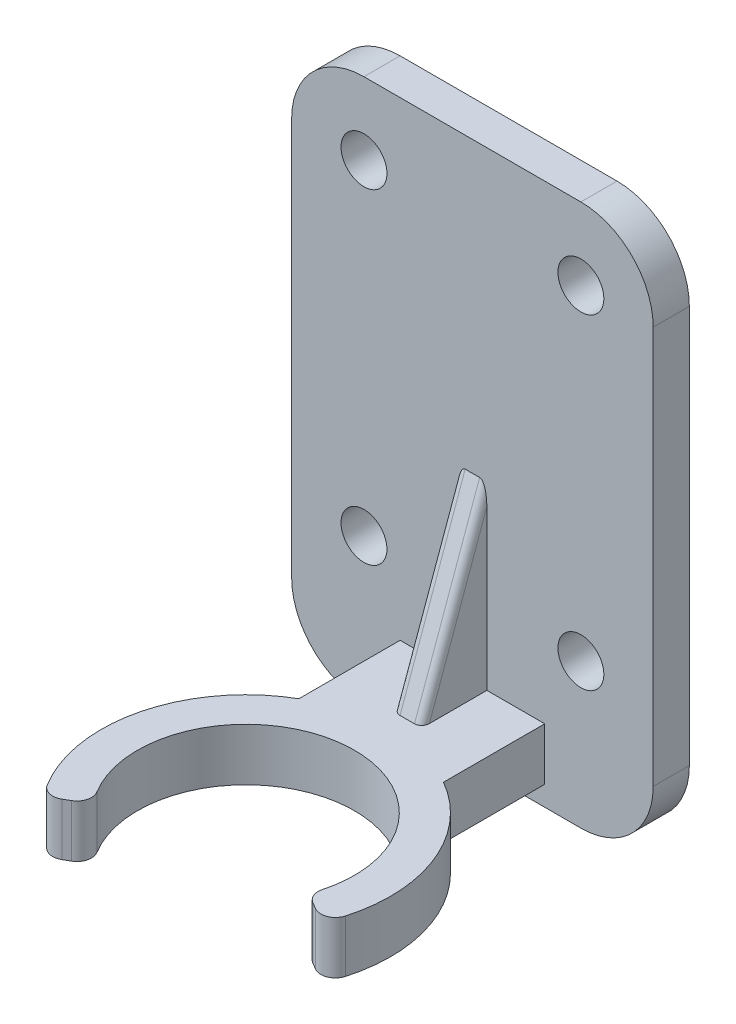
ISO-10303-21;
HEADER;
FILE_DESCRIPTION(('STEP AP214'),'2;1');
FILE_NAME('part.step','',(''),(''),'','','');
FILE_SCHEMA(('AUTOMOTIVE_DESIGN { 1 0 10303 214 1 1 1 1 }'));
ENDSEC;
DATA;
#1=APPLICATION_CONTEXT('core data for automotive mechanical design processes');
#2=APPLICATION_PROTOCOL_DEFINITION('international standard','automotive_design',2000,#1);
#3=PRODUCT_CONTEXT('',#1,'mechanical');
#4=PRODUCT('Part','Part','',(#3));
#5=PRODUCT_RELATED_PRODUCT_CATEGORY('part','',(#4));
#6=PRODUCT_DEFINITION_FORMATION('','',#4);
#7=PRODUCT_DEFINITION_CONTEXT('part definition',#1,'design');
#8=PRODUCT_DEFINITION('design','',#6,#7);
#9=PRODUCT_DEFINITION_SHAPE('','',#8);
#10=(LENGTH_UNIT() NAMED_UNIT(*) SI_UNIT(.MILLI.,.METRE.));
#11=(NAMED_UNIT(*) PLANE_ANGLE_UNIT() SI_UNIT($,.RADIAN.));
#12=(NAMED_UNIT(*) SI_UNIT($,.STERADIAN.) SOLID_ANGLE_UNIT());
#13=UNCERTAINTY_MEASURE_WITH_UNIT(LENGTH_MEASURE(1.E-05),#10,'distance_accuracy_value','');
#14=(GEOMETRIC_REPRESENTATION_CONTEXT(3) GLOBAL_UNCERTAINTY_ASSIGNED_CONTEXT((#13)) GLOBAL_UNIT_ASSIGNED_CONTEXT((#10,
#11,#12)) REPRESENTATION_CONTEXT('',''));
#15=CARTESIAN_POINT('',(0.,0.,0.));
#16=DIRECTION('',(0.,0.,1.));
#17=DIRECTION('',(1.,0.,0.));
#18=AXIS2_PLACEMENT_3D('',#15,#16,#17);
#19=CARTESIAN_POINT('',(17.3091515089871,10.,4.93895475165852));
#20=DIRECTION('',(0.,-1.,0.));
#21=DIRECTION('',(0.,0.,-1.));
#22=AXIS2_PLACEMENT_3D('',#19,#20,#21);
#23=CYLINDRICAL_SURFACE('',#22,2.);
#24=DIRECTION('',(0.,-1.,0.));
#25=VECTOR('',#24,1.);
#26=CARTESIAN_POINT('',(16.3091515089871,10.,6.6710055592274));
#27=LINE('',#26,#25);
#28=CARTESIAN_POINT('',(16.3091515089871,10.,6.6710055592274));
#29=VERTEX_POINT('',#28);
#30=CARTESIAN_POINT('',(16.3091515089871,2.75,6.6710055592274));
#31=VERTEX_POINT('',#30);
#32=EDGE_CURVE('E280',#29,#31,#27,.T.);
#33=ORIENTED_EDGE('',*,*,#32,.T.);
#34=CARTESIAN_POINT('',(17.3091515089871,2.75,4.93895475165852));
#35=DIRECTION('',(0.,1.,0.));
#36=DIRECTION('',(0.,0.,1.));
#37=AXIS2_PLACEMENT_3D('',#34,#35,#36);
#38=CIRCLE('',#37,2.);
#39=CARTESIAN_POINT('',(19.2323905655412,2.75,5.48772750184279));
#40=VERTEX_POINT('',#39);
#41=EDGE_CURVE('E217',#31,#40,#38,.T.);
#42=ORIENTED_EDGE('',*,*,#41,.T.);
#43=DIRECTION('',(0.,-1.,0.));
#44=VECTOR('',#43,1.);
#45=CARTESIAN_POINT('',(19.2323905655412,10.,5.48772750184279));
#46=LINE('',#45,#44);
#47=CARTESIAN_POINT('',(19.2323905655412,10.,5.48772750184279));
#48=VERTEX_POINT('',#47);
#49=EDGE_CURVE('E315',#48,#40,#46,.T.);
#50=ORIENTED_EDGE('',*,*,#49,.F.);
#51=CARTESIAN_POINT('',(17.3091515089871,10.,4.93895475165852));
#52=DIRECTION('',(0.,1.,0.));
#53=DIRECTION('',(0.,0.,-1.));
#54=AXIS2_PLACEMENT_3D('',#51,#52,#53);
#55=CIRCLE('',#54,2.);
#56=EDGE_CURVE('E246',#29,#48,#55,.T.);
#57=ORIENTED_EDGE('',*,*,#56,.F.);
#58=EDGE_LOOP('',(#33,#42,#50,#57));
#59=FACE_BOUND('',#58,.T.);
#60=ADVANCED_FACE('F38',(#59),#23,.T.);
#61=CARTESIAN_POINT('',(0.,10.,0.));
#62=DIRECTION('',(0.,-1.,0.));
#63=DIRECTION('',(0.,0.,-1.));
#64=AXIS2_PLACEMENT_3D('',#61,#62,#63);
#65=CYLINDRICAL_SURFACE('',#64,20.);
#66=ORIENTED_EDGE('',*,*,#49,.T.);
#67=CARTESIAN_POINT('',(0.,2.75,0.));
#68=DIRECTION('',(0.,1.,0.));
#69=DIRECTION('',(0.,0.,1.));
#70=AXIS2_PLACEMENT_3D('',#67,#68,#69);
#71=CIRCLE('',#70,20.);
#72=CARTESIAN_POINT('',(10.,2.75,-17.3205080756888));
#73=VERTEX_POINT('',#72);
#74=EDGE_CURVE('E537',#40,#73,#71,.T.);
#75=ORIENTED_EDGE('',*,*,#74,.T.);
#76=DIRECTION('',(0.,-1.,0.));
#77=VECTOR('',#76,1.);
#78=CARTESIAN_POINT('',(10.,10.,-17.3205080756888));
#79=LINE('',#78,#77);
#80=CARTESIAN_POINT('',(10.,10.,-17.3205080756888));
#81=VERTEX_POINT('',#80);
#82=EDGE_CURVE('E311',#81,#73,#79,.T.);
#83=ORIENTED_EDGE('',*,*,#82,.F.);
#84=CARTESIAN_POINT('',(0.,10.,0.));
#85=DIRECTION('',(0.,1.,0.));
#86=DIRECTION('',(0.,0.,1.));
#87=AXIS2_PLACEMENT_3D('',#84,#85,#86);
#88=CIRCLE('',#87,20.);
#89=EDGE_CURVE('E250',#48,#81,#88,.T.);
#90=ORIENTED_EDGE('',*,*,#89,.F.);
#91=EDGE_LOOP('',(#66,#75,#83,#90));
#92=FACE_BOUND('',#91,.T.);
#93=ADVANCED_FACE('F502',(#92),#65,.T.);
#94=CARTESIAN_POINT('',(10.,10.,-17.3205080756888));
#95=DIRECTION('',(-1.,0.,0.));
#96=DIRECTION('',(0.,0.,1.));
#97=AXIS2_PLACEMENT_3D('',#94,#95,#96);
#98=PLANE('',#97);
#99=ORIENTED_EDGE('',*,*,#82,.T.);
#100=DIRECTION('',(0.,0.,-1.));
#101=VECTOR('',#100,1.);
#102=CARTESIAN_POINT('',(10.,2.75,-17.3205080756888));
#103=LINE('',#102,#101);
#104=CARTESIAN_POINT('',(10.,2.75,-31.3205080756888));
#105=VERTEX_POINT('',#104);
#106=EDGE_CURVE('E532',#73,#105,#103,.T.);
#107=ORIENTED_EDGE('',*,*,#106,.T.);
#108=DIRECTION('',(0.,-1.,0.));
#109=VECTOR('',#108,1.);
#110=CARTESIAN_POINT('',(10.,0.,-31.3205080756888));
#111=LINE('',#110,#109);
#112=CARTESIAN_POINT('',(10.,10.,-31.3205080756888));
#113=VERTEX_POINT('',#112);
#114=EDGE_CURVE('E227',#113,#105,#111,.T.);
#115=ORIENTED_EDGE('',*,*,#114,.F.);
#116=DIRECTION('',(0.,0.,-1.));
#117=VECTOR('',#116,1.);
#118=CARTESIAN_POINT('',(10.,10.,-17.3205080756888));
#119=LINE('',#118,#117);
#120=EDGE_CURVE('E253',#81,#113,#119,.T.);
#121=ORIENTED_EDGE('',*,*,#120,.F.);
#122=EDGE_LOOP('',(#99,#107,#115,#121));
#123=FACE_BOUND('',#122,.T.);
#124=ADVANCED_FACE('F509',(#123),#98,.F.);
#125=CARTESIAN_POINT('',(-9.99999999999999,10.,-17.3205080756888));
#126=DIRECTION('',(1.,0.,0.));
#127=DIRECTION('',(0.,0.,-1.));
#128=AXIS2_PLACEMENT_3D('',#125,#126,#127);
#129=PLANE('',#128);
#130=DIRECTION('',(0.,1.,0.));
#131=VECTOR('',#130,1.);
#132=CARTESIAN_POINT('',(-9.99999999999999,0.,-31.3205080756888));
#133=LINE('',#132,#131);
#134=CARTESIAN_POINT('',(-9.99999999999999,2.75,-31.3205080756888));
#135=VERTEX_POINT('',#134);
#136=CARTESIAN_POINT('',(-9.99999999999999,10.,-31.3205080756888));
#137=VERTEX_POINT('',#136);
#138=EDGE_CURVE('E224',#135,#137,#133,.T.);
#139=ORIENTED_EDGE('',*,*,#138,.F.);
#140=DIRECTION('',(0.,0.,1.));
#141=VECTOR('',#140,1.);
#142=CARTESIAN_POINT('',(-9.99999999999999,2.75,-17.3205080756888));
#143=LINE('',#142,#141);
#144=CARTESIAN_POINT('',(-9.99999999999999,2.75,-17.3205080756888));
#145=VERTEX_POINT('',#144);
#146=EDGE_CURVE('E205',#135,#145,#143,.T.);
#147=ORIENTED_EDGE('',*,*,#146,.T.);
#148=DIRECTION('',(0.,-1.,0.));
#149=VECTOR('',#148,1.);
#150=CARTESIAN_POINT('',(-9.99999999999999,10.,-17.3205080756888));
#151=LINE('',#150,#149);
#152=CARTESIAN_POINT('',(-9.99999999999999,10.,-17.3205080756888));
#153=VERTEX_POINT('',#152);
#154=EDGE_CURVE('E308',#153,#145,#151,.T.);
#155=ORIENTED_EDGE('',*,*,#154,.F.);
#156=DIRECTION('',(0.,0.,1.));
#157=VECTOR('',#156,1.);
#158=CARTESIAN_POINT('',(-9.99999999999999,10.,-17.3205080756888));
#159=LINE('',#158,#157);
#160=EDGE_CURVE('E232',#137,#153,#159,.T.);
#161=ORIENTED_EDGE('',*,*,#160,.F.);
#162=EDGE_LOOP('',(#139,#147,#155,#161));
#163=FACE_BOUND('',#162,.T.);
#164=ADVANCED_FACE('F231',(#163),#129,.F.);
#165=CARTESIAN_POINT('',(0.,10.,0.));
#166=DIRECTION('',(0.,-1.,0.));
#167=DIRECTION('',(0.,0.,-1.));
#168=AXIS2_PLACEMENT_3D('',#165,#166,#167);
#169=CYLINDRICAL_SURFACE('',#168,20.);
#170=ORIENTED_EDGE('',*,*,#154,.T.);
#171=CARTESIAN_POINT('',(0.,2.75,0.));
#172=DIRECTION('',(0.,1.,0.));
#173=DIRECTION('',(0.,0.,1.));
#174=AXIS2_PLACEMENT_3D('',#171,#172,#173);
#175=CIRCLE('',#174,20.);
#176=CARTESIAN_POINT('',(-17.0836954306657,2.75,10.3993918299221));
#177=VERTEX_POINT('',#176);
#178=EDGE_CURVE('E211',#145,#177,#175,.T.);
#179=ORIENTED_EDGE('',*,*,#178,.T.);
#180=DIRECTION('',(0.,-1.,0.));
#181=VECTOR('',#180,1.);
#182=CARTESIAN_POINT('',(-17.0836954306657,10.,10.3993918299221));
#183=LINE('',#182,#181);
#184=CARTESIAN_POINT('',(-17.0836954306657,10.,10.3993918299221));
#185=VERTEX_POINT('',#184);
#186=EDGE_CURVE('E304',#185,#177,#183,.T.);
#187=ORIENTED_EDGE('',*,*,#186,.F.);
#188=CARTESIAN_POINT('',(0.,10.,0.));
#189=DIRECTION('',(0.,1.,0.));
#190=DIRECTION('',(0.,0.,1.));
#191=AXIS2_PLACEMENT_3D('',#188,#189,#190);
#192=CIRCLE('',#191,20.);
#193=EDGE_CURVE('E259',#153,#185,#192,.T.);
#194=ORIENTED_EDGE('',*,*,#193,.F.);
#195=EDGE_LOOP('',(#170,#179,#187,#194));
#196=FACE_BOUND('',#195,.T.);
#197=ADVANCED_FACE('F752',(#196),#169,.T.);
#198=CARTESIAN_POINT('',(-15.3753258875992,10.,9.35945264692992));
#199=DIRECTION('',(0.,-1.,0.));
#200=DIRECTION('',(0.,0.,-1.));
#201=AXIS2_PLACEMENT_3D('',#198,#199,#200);
#202=CYLINDRICAL_SURFACE('',#201,2.);
#203=ORIENTED_EDGE('',*,*,#186,.T.);
#204=CARTESIAN_POINT('',(-15.3753258875992,2.75,9.35945264692992));
#205=DIRECTION('',(0.,1.,0.));
#206=DIRECTION('',(0.,0.,1.));
#207=AXIS2_PLACEMENT_3D('',#204,#205,#206);
#208=CIRCLE('',#207,2.);
#209=CARTESIAN_POINT('',(-14.3753258875991,2.75,11.0915034544988));
#210=VERTEX_POINT('',#209);
#211=EDGE_CURVE('E856',#177,#210,#208,.T.);
#212=ORIENTED_EDGE('',*,*,#211,.T.);
#213=DIRECTION('',(0.,-1.,0.));
#214=VECTOR('',#213,1.);
#215=CARTESIAN_POINT('',(-14.3753258875991,10.,11.0915034544988));
#216=LINE('',#215,#214);
#217=CARTESIAN_POINT('',(-14.3753258875991,10.,11.0915034544988));
#218=VERTEX_POINT('',#217);
#219=EDGE_CURVE('E300',#218,#210,#216,.T.);
#220=ORIENTED_EDGE('',*,*,#219,.F.);
#221=CARTESIAN_POINT('',(-15.3753258875992,10.,9.35945264692992));
#222=DIRECTION('',(0.,1.,0.));
#223=DIRECTION('',(0.,0.,1.));
#224=AXIS2_PLACEMENT_3D('',#221,#222,#223);
#225=CIRCLE('',#224,2.);
#226=EDGE_CURVE('E262',#185,#218,#225,.T.);
#227=ORIENTED_EDGE('',*,*,#226,.F.);
#228=EDGE_LOOP('',(#203,#212,#220,#227));
#229=FACE_BOUND('',#228,.T.);
#230=ADVANCED_FACE('F744',(#229),#202,.T.);
#231=CARTESIAN_POINT('',(-13.5090532951148,10.,10.5913607400364));
#232=DIRECTION('',(-0.500000000000007,0.,-0.866025403784435));
#233=DIRECTION('',(-0.866025403784435,0.,0.500000000000007));
#234=AXIS2_PLACEMENT_3D('',#231,#232,#233);
#235=PLANE('',#234);
#236=ORIENTED_EDGE('',*,*,#219,.T.);
#237=DIRECTION('',(0.866025403784435,0.,-0.500000000000007));
#238=VECTOR('',#237,1.);
#239=CARTESIAN_POINT('',(-13.5090532951148,2.75,10.5913607400364));
#240=LINE('',#239,#238);
#241=CARTESIAN_POINT('',(-13.5090532951148,2.75,10.5913607400364));
#242=VERTEX_POINT('',#241);
#243=EDGE_CURVE('E859',#210,#242,#240,.T.);
#244=ORIENTED_EDGE('',*,*,#243,.T.);
#245=DIRECTION('',(0.,-1.,0.));
#246=VECTOR('',#245,1.);
#247=CARTESIAN_POINT('',(-13.5090532951148,10.,10.5913607400364));
#248=LINE('',#247,#246);
#249=CARTESIAN_POINT('',(-13.5090532951148,10.,10.5913607400364));
#250=VERTEX_POINT('',#249);
#251=EDGE_CURVE('E296',#250,#242,#248,.T.);
#252=ORIENTED_EDGE('',*,*,#251,.F.);
#253=DIRECTION('',(0.866025403784435,0.,-0.500000000000007));
#254=VECTOR('',#253,1.);
#255=CARTESIAN_POINT('',(-13.5090532951148,10.,10.5913607400364));
#256=LINE('',#255,#254);
#257=EDGE_CURVE('E265',#218,#250,#256,.T.);
#258=ORIENTED_EDGE('',*,*,#257,.F.);
#259=EDGE_LOOP('',(#236,#244,#252,#258));
#260=FACE_BOUND('',#259,.T.);
#261=ADVANCED_FACE('F736',(#260),#235,.F.);
#262=CARTESIAN_POINT('',(-14.5090532951148,10.,8.85930993246749));
#263=DIRECTION('',(0.,-1.,0.));
#264=DIRECTION('',(0.,0.,-1.));
#265=AXIS2_PLACEMENT_3D('',#262,#263,#264);
#266=CYLINDRICAL_SURFACE('',#265,2.);
#267=ORIENTED_EDGE('',*,*,#251,.T.);
#268=CARTESIAN_POINT('',(-14.5090532951148,2.75,8.85930993246749));
#269=DIRECTION('',(0.,1.,0.));
#270=DIRECTION('',(0.,0.,1.));
#271=AXIS2_PLACEMENT_3D('',#268,#269,#270);
#272=CIRCLE('',#271,2.);
#273=CARTESIAN_POINT('',(-12.8021058486307,2.75,7.81703817570662));
#274=VERTEX_POINT('',#273);
#275=EDGE_CURVE('E880',#242,#274,#272,.T.);
#276=ORIENTED_EDGE('',*,*,#275,.T.);
#277=DIRECTION('',(0.,-1.,0.));
#278=VECTOR('',#277,1.);
#279=CARTESIAN_POINT('',(-12.8021058486307,10.,7.81703817570661));
#280=LINE('',#279,#278);
#281=CARTESIAN_POINT('',(-12.8021058486307,10.,7.81703817570661));
#282=VERTEX_POINT('',#281);
#283=EDGE_CURVE('E292',#282,#274,#280,.T.);
#284=ORIENTED_EDGE('',*,*,#283,.F.);
#285=CARTESIAN_POINT('',(-14.5090532951148,10.,8.85930993246749));
#286=DIRECTION('',(0.,1.,0.));
#287=DIRECTION('',(0.,0.,-1.));
#288=AXIS2_PLACEMENT_3D('',#285,#286,#287);
#289=CIRCLE('',#288,2.);
#290=EDGE_CURVE('E268',#250,#282,#289,.T.);
#291=ORIENTED_EDGE('',*,*,#290,.F.);
#292=EDGE_LOOP('',(#267,#276,#284,#291));
#293=FACE_BOUND('',#292,.T.);
#294=ADVANCED_FACE('F728',(#293),#266,.T.);
#295=CARTESIAN_POINT('',(0.,10.,0.));
#296=DIRECTION('',(0.,-1.,0.));
#297=DIRECTION('',(0.,0.,-1.));
#298=AXIS2_PLACEMENT_3D('',#295,#296,#297);
#299=CYLINDRICAL_SURFACE('',#298,15.);
#300=ORIENTED_EDGE('',*,*,#283,.T.);
#301=CARTESIAN_POINT('',(0.,2.75,0.));
#302=DIRECTION('',(0.,1.,0.));
#303=DIRECTION('',(0.,0.,1.));
#304=AXIS2_PLACEMENT_3D('',#301,#302,#303);
#305=CIRCLE('',#304,15.);
#306=CARTESIAN_POINT('',(14.4835294689525,2.75,3.90222681580456));
#307=VERTEX_POINT('',#306);
#308=EDGE_CURVE('E867',#274,#307,#305,.F.);
#309=ORIENTED_EDGE('',*,*,#308,.T.);
#310=DIRECTION('',(0.,-1.,0.));
#311=VECTOR('',#310,1.);
#312=CARTESIAN_POINT('',(14.4835294689525,10.,3.90222681580456));
#313=LINE('',#312,#311);
#314=CARTESIAN_POINT('',(14.4835294689525,10.,3.90222681580456));
#315=VERTEX_POINT('',#314);
#316=EDGE_CURVE('E288',#315,#307,#313,.T.);
#317=ORIENTED_EDGE('',*,*,#316,.F.);
#318=CARTESIAN_POINT('',(0.,10.,0.));
#319=DIRECTION('',(0.,-1.,0.));
#320=DIRECTION('',(0.,0.,1.));
#321=AXIS2_PLACEMENT_3D('',#318,#319,#320);
#322=CIRCLE('',#321,15.);
#323=EDGE_CURVE('E271',#282,#315,#322,.T.);
#324=ORIENTED_EDGE('',*,*,#323,.F.);
#325=EDGE_LOOP('',(#300,#309,#317,#324));
#326=FACE_BOUND('',#325,.T.);
#327=ADVANCED_FACE('F720',(#326),#299,.F.);
#328=CARTESIAN_POINT('',(16.4146667314795,10.,4.4225237245785));
#329=DIRECTION('',(0.,-1.,0.));
#330=DIRECTION('',(0.,0.,-1.));
#331=AXIS2_PLACEMENT_3D('',#328,#329,#330);
#332=CYLINDRICAL_SURFACE('',#331,2.);
#333=ORIENTED_EDGE('',*,*,#316,.T.);
#334=CARTESIAN_POINT('',(16.4146667314795,2.75,4.4225237245785));
#335=DIRECTION('',(0.,1.,0.));
#336=DIRECTION('',(0.,0.,1.));
#337=AXIS2_PLACEMENT_3D('',#334,#335,#336);
#338=CIRCLE('',#337,2.);
#339=CARTESIAN_POINT('',(15.4146667314795,2.75,6.15457453214738));
#340=VERTEX_POINT('',#339);
#341=EDGE_CURVE('E870',#307,#340,#338,.T.);
#342=ORIENTED_EDGE('',*,*,#341,.T.);
#343=DIRECTION('',(0.,-1.,0.));
#344=VECTOR('',#343,1.);
#345=CARTESIAN_POINT('',(15.4146667314795,10.,6.15457453214738));
#346=LINE('',#345,#344);
#347=CARTESIAN_POINT('',(15.4146667314795,10.,6.15457453214738));
#348=VERTEX_POINT('',#347);
#349=EDGE_CURVE('E284',#348,#340,#346,.T.);
#350=ORIENTED_EDGE('',*,*,#349,.F.);
#351=CARTESIAN_POINT('',(16.4146667314795,10.,4.4225237245785));
#352=DIRECTION('',(0.,1.,0.));
#353=DIRECTION('',(0.,0.,-1.));
#354=AXIS2_PLACEMENT_3D('',#351,#352,#353);
#355=CIRCLE('',#354,2.);
#356=EDGE_CURVE('E274',#315,#348,#355,.T.);
#357=ORIENTED_EDGE('',*,*,#356,.F.);
#358=EDGE_LOOP('',(#333,#342,#350,#357));
#359=FACE_BOUND('',#358,.T.);
#360=ADVANCED_FACE('F712',(#359),#332,.T.);
#361=CARTESIAN_POINT('',(16.3091515089871,10.,6.6710055592274));
#362=DIRECTION('',(0.500000000000001,0.,-0.866025403784438));
#363=DIRECTION('',(-0.866025403784438,0.,-0.500000000000001));
#364=AXIS2_PLACEMENT_3D('',#361,#362,#363);
#365=PLANE('',#364);
#366=ORIENTED_EDGE('',*,*,#349,.T.);
#367=DIRECTION('',(0.866025403784438,0.,0.500000000000001));
#368=VECTOR('',#367,1.);
#369=CARTESIAN_POINT('',(16.3091515089871,2.75,6.6710055592274));
#370=LINE('',#369,#368);
#371=EDGE_CURVE('E229',#340,#31,#370,.T.);
#372=ORIENTED_EDGE('',*,*,#371,.T.);
#373=ORIENTED_EDGE('',*,*,#32,.F.);
#374=DIRECTION('',(0.866025403784438,0.,0.500000000000001));
#375=VECTOR('',#374,1.);
#376=CARTESIAN_POINT('',(16.3091515089871,10.,6.6710055592274));
#377=LINE('',#376,#375);
#378=EDGE_CURVE('E277',#348,#29,#377,.T.);
#379=ORIENTED_EDGE('',*,*,#378,.F.);
#380=EDGE_LOOP('',(#366,#372,#373,#379));
#381=FACE_BOUND('',#380,.T.);
#382=ADVANCED_FACE('F708',(#381),#365,.F.);
#383=CARTESIAN_POINT('',(17.3091515089871,10.,4.93895475165852));
#384=DIRECTION('',(0.,-1.,0.));
#385=DIRECTION('',(0.,0.,-1.));
#386=AXIS2_PLACEMENT_3D('',#383,#384,#385);
#387=PLANE('',#386);
#388=DIRECTION('',(1.,0.,0.));
#389=VECTOR('',#388,1.);
#390=CARTESIAN_POINT('',(10.,10.,-31.3205080756888));
#391=LINE('',#390,#389);
#392=CARTESIAN_POINT('',(2.,10.,-31.3205080756888));
#393=VERTEX_POINT('',#392);
#394=EDGE_CURVE('E235',#393,#113,#391,.T.);
#395=ORIENTED_EDGE('',*,*,#394,.F.);
#396=DIRECTION('',(0.,0.,1.));
#397=VECTOR('',#396,1.);
#398=CARTESIAN_POINT('',(2.,10.,-31.3205080756888));
#399=LINE('',#398,#397);
#400=CARTESIAN_POINT('',(2.,10.,-23.3740555607769));
#401=VERTEX_POINT('',#400);
#402=EDGE_CURVE('E359',#393,#401,#399,.T.);
#403=ORIENTED_EDGE('',*,*,#402,.T.);
#404=CARTESIAN_POINT('',(1.,10.,-23.3740555607769));
#405=DIRECTION('',(0.,-1.,0.));
#406=DIRECTION('',(0.,0.,-1.));
#407=AXIS2_PLACEMENT_3D('',#404,#405,#406);
#408=ELLIPSE('',#407,1.06295392517469,1.);
#409=CARTESIAN_POINT('',(1.,10.,-22.3111016356022));
#410=VERTEX_POINT('',#409);
#411=EDGE_CURVE('E335',#401,#410,#408,.T.);
#412=ORIENTED_EDGE('',*,*,#411,.T.);
#413=DIRECTION('',(-1.,0.,0.));
#414=VECTOR('',#413,1.);
#415=CARTESIAN_POINT('',(2.,10.,-22.3111016356022));
#416=LINE('',#415,#414);
#417=CARTESIAN_POINT('',(-0.999999999999998,10.,-22.3111016356022));
#418=VERTEX_POINT('',#417);
#419=EDGE_CURVE('E349',#410,#418,#416,.T.);
#420=ORIENTED_EDGE('',*,*,#419,.T.);
#421=CARTESIAN_POINT('',(-0.999999999999998,10.,-23.3740555607769));
#422=DIRECTION('',(0.,-1.,0.));
#423=DIRECTION('',(0.,0.,1.));
#424=AXIS2_PLACEMENT_3D('',#421,#422,#423);
#425=ELLIPSE('',#424,1.06295392517469,1.);
#426=CARTESIAN_POINT('',(-2.,10.,-23.3740555607769));
#427=VERTEX_POINT('',#426);
#428=EDGE_CURVE('E11',#418,#427,#425,.T.);
#429=ORIENTED_EDGE('',*,*,#428,.T.);
#430=DIRECTION('',(0.,0.,1.));
#431=VECTOR('',#430,1.);
#432=CARTESIAN_POINT('',(-2.,10.,-31.3205080756888));
#433=LINE('',#432,#431);
#434=CARTESIAN_POINT('',(-2.,10.,-31.3205080756888));
#435=VERTEX_POINT('',#434);
#436=EDGE_CURVE('E353',#435,#427,#433,.T.);
#437=ORIENTED_EDGE('',*,*,#436,.F.);
#438=EDGE_CURVE('E239',#137,#435,#391,.T.);
#439=ORIENTED_EDGE('',*,*,#438,.F.);
#440=ORIENTED_EDGE('',*,*,#160,.T.);
#441=ORIENTED_EDGE('',*,*,#193,.T.);
#442=ORIENTED_EDGE('',*,*,#226,.T.);
#443=ORIENTED_EDGE('',*,*,#257,.T.);
#444=ORIENTED_EDGE('',*,*,#290,.T.);
#445=ORIENTED_EDGE('',*,*,#323,.T.);
#446=ORIENTED_EDGE('',*,*,#356,.T.);
#447=ORIENTED_EDGE('',*,*,#378,.T.);
#448=ORIENTED_EDGE('',*,*,#56,.T.);
#449=ORIENTED_EDGE('',*,*,#89,.T.);
#450=ORIENTED_EDGE('',*,*,#120,.T.);
#451=EDGE_LOOP('',(#395,#403,#412,#420,#429,#437,#439,#440,#441,#442,#443,#444,#445,#446,#447,
#448,#449,#450));
#452=FACE_BOUND('',#451,.T.);
#453=ADVANCED_FACE('F526',(#452),#387,.F.);
#454=CARTESIAN_POINT('',(17.3091515089871,0.,4.93895475165852));
#455=DIRECTION('',(0.,-1.,0.));
#456=DIRECTION('',(0.,0.,-1.));
#457=AXIS2_PLACEMENT_3D('',#454,#455,#456);
#458=PLANE('',#457);
#459=DIRECTION('',(-1.,0.,0.));
#460=VECTOR('',#459,1.);
#461=CARTESIAN_POINT('',(14.9999999999999,0.,-31.3205080756888));
#462=LINE('',#461,#460);
#463=CARTESIAN_POINT('',(14.9999999999999,0.,-31.3205080756888));
#464=VERTEX_POINT('',#463);
#465=CARTESIAN_POINT('',(-14.9999999999999,0.,-31.3205080756888));
#466=VERTEX_POINT('',#465);
#467=EDGE_CURVE('E403',#464,#466,#462,.T.);
#468=ORIENTED_EDGE('',*,*,#467,.T.);
#469=DIRECTION('',(0.,0.,1.));
#470=VECTOR('',#469,1.);
#471=CARTESIAN_POINT('',(-14.9999999999999,0.,-36.3205080756888));
#472=LINE('',#471,#470);
#473=CARTESIAN_POINT('',(-14.9999999999999,0.,-36.3205080756888));
#474=VERTEX_POINT('',#473);
#475=EDGE_CURVE('E446',#474,#466,#472,.T.);
#476=ORIENTED_EDGE('',*,*,#475,.F.);
#477=DIRECTION('',(-1.,0.,0.));
#478=VECTOR('',#477,1.);
#479=CARTESIAN_POINT('',(14.9999999999999,0.,-36.3205080756888));
#480=LINE('',#479,#478);
#481=CARTESIAN_POINT('',(14.9999999999999,0.,-36.3205080756888));
#482=VERTEX_POINT('',#481);
#483=EDGE_CURVE('E378',#482,#474,#480,.T.);
#484=ORIENTED_EDGE('',*,*,#483,.F.);
#485=DIRECTION('',(0.,0.,1.));
#486=VECTOR('',#485,1.);
#487=CARTESIAN_POINT('',(14.9999999999999,0.,-36.3205080756888));
#488=LINE('',#487,#486);
#489=EDGE_CURVE('E241',#482,#464,#488,.T.);
#490=ORIENTED_EDGE('',*,*,#489,.T.);
#491=EDGE_LOOP('',(#468,#476,#484,#490));
#492=FACE_BOUND('',#491,.T.);
#493=ADVANCED_FACE('F453',(#492),#458,.T.);
#494=CARTESIAN_POINT('',(15.,10.,-36.3205080756888));
#495=DIRECTION('',(0.,0.,1.));
#496=DIRECTION('',(1.,0.,0.));
#497=AXIS2_PLACEMENT_3D('',#494,#495,#496);
#498=CYLINDRICAL_SURFACE('',#497,10.);
#499=CARTESIAN_POINT('',(15.,10.,-31.3205080756888));
#500=DIRECTION('',(0.,0.,-1.));
#501=DIRECTION('',(1.,0.,0.));
#502=AXIS2_PLACEMENT_3D('',#499,#500,#501);
#503=CIRCLE('',#502,10.);
#504=CARTESIAN_POINT('',(25.,10.0000000000001,-31.3205080756888));
#505=VERTEX_POINT('',#504);
#506=EDGE_CURVE('E348',#505,#464,#503,.T.);
#507=ORIENTED_EDGE('',*,*,#506,.T.);
#508=ORIENTED_EDGE('',*,*,#489,.F.);
#509=CARTESIAN_POINT('',(15.,10.,-36.3205080756888));
#510=DIRECTION('',(0.,0.,-1.));
#511=DIRECTION('',(1.,0.,0.));
#512=AXIS2_PLACEMENT_3D('',#509,#510,#511);
#513=CIRCLE('',#512,10.);
#514=CARTESIAN_POINT('',(25.,10.0000000000001,-36.3205080756888));
#515=VERTEX_POINT('',#514);
#516=EDGE_CURVE('E374',#515,#482,#513,.T.);
#517=ORIENTED_EDGE('',*,*,#516,.F.);
#518=DIRECTION('',(0.,0.,1.));
#519=VECTOR('',#518,1.);
#520=CARTESIAN_POINT('',(25.,10.0000000000001,-36.3205080756888));
#521=LINE('',#520,#519);
#522=EDGE_CURVE('E400',#515,#505,#521,.T.);
#523=ORIENTED_EDGE('',*,*,#522,.T.);
#524=EDGE_LOOP('',(#507,#508,#517,#523));
#525=FACE_BOUND('',#524,.T.);
#526=ADVANCED_FACE('F458',(#525),#498,.T.);
#527=CARTESIAN_POINT('',(-15.,10.,-36.3205080756888));
#528=DIRECTION('',(0.,0.,1.));
#529=DIRECTION('',(1.,0.,0.));
#530=AXIS2_PLACEMENT_3D('',#527,#528,#529);
#531=CYLINDRICAL_SURFACE('',#530,10.);
#532=CARTESIAN_POINT('',(-15.,10.,-31.3205080756888));
#533=DIRECTION('',(0.,0.,-1.));
#534=DIRECTION('',(-1.,0.,0.));
#535=AXIS2_PLACEMENT_3D('',#532,#533,#534);
#536=CIRCLE('',#535,10.);
#537=CARTESIAN_POINT('',(-25.,10.,-31.3205080756888));
#538=VERTEX_POINT('',#537);
#539=EDGE_CURVE('E406',#466,#538,#536,.T.);
#540=ORIENTED_EDGE('',*,*,#539,.T.);
#541=DIRECTION('',(0.,0.,1.));
#542=VECTOR('',#541,1.);
#543=CARTESIAN_POINT('',(-25.,10.,-36.3205080756888));
#544=LINE('',#543,#542);
#545=CARTESIAN_POINT('',(-25.,10.,-36.3205080756888));
#546=VERTEX_POINT('',#545);
#547=EDGE_CURVE('E442',#546,#538,#544,.T.);
#548=ORIENTED_EDGE('',*,*,#547,.F.);
#549=CARTESIAN_POINT('',(-15.,10.,-36.3205080756888));
#550=DIRECTION('',(0.,0.,-1.));
#551=DIRECTION('',(-1.,0.,0.));
#552=AXIS2_PLACEMENT_3D('',#549,#550,#551);
#553=CIRCLE('',#552,10.);
#554=EDGE_CURVE('E382',#474,#546,#553,.T.);
#555=ORIENTED_EDGE('',*,*,#554,.F.);
#556=ORIENTED_EDGE('',*,*,#475,.T.);
#557=EDGE_LOOP('',(#540,#548,#555,#556));
#558=FACE_BOUND('',#557,.T.);
#559=ADVANCED_FACE('F468',(#558),#531,.T.);
#560=CARTESIAN_POINT('',(-25.,64.9999999999999,-36.3205080756888));
#561=DIRECTION('',(1.,0.,0.));
#562=DIRECTION('',(0.,1.,0.));
#563=AXIS2_PLACEMENT_3D('',#560,#561,#562);
#564=PLANE('',#563);
#565=DIRECTION('',(0.,1.,0.));
#566=VECTOR('',#565,1.);
#567=CARTESIAN_POINT('',(-25.,64.9999999999999,-31.3205080756888));
#568=LINE('',#567,#566);
#569=CARTESIAN_POINT('',(-25.,64.9999999999999,-31.3205080756888));
#570=VERTEX_POINT('',#569);
#571=EDGE_CURVE('E409',#538,#570,#568,.T.);
#572=ORIENTED_EDGE('',*,*,#571,.T.);
#573=DIRECTION('',(0.,0.,1.));
#574=VECTOR('',#573,1.);
#575=CARTESIAN_POINT('',(-25.,64.9999999999999,-36.3205080756888));
#576=LINE('',#575,#574);
#577=CARTESIAN_POINT('',(-25.,64.9999999999999,-36.3205080756888));
#578=VERTEX_POINT('',#577);
#579=EDGE_CURVE('E438',#578,#570,#576,.T.);
#580=ORIENTED_EDGE('',*,*,#579,.F.);
#581=DIRECTION('',(0.,1.,0.));
#582=VECTOR('',#581,1.);
#583=CARTESIAN_POINT('',(-25.,64.9999999999999,-36.3205080756888));
#584=LINE('',#583,#582);
#585=EDGE_CURVE('E385',#546,#578,#584,.T.);
#586=ORIENTED_EDGE('',*,*,#585,.F.);
#587=ORIENTED_EDGE('',*,*,#547,.T.);
#588=EDGE_LOOP('',(#572,#580,#586,#587));
#589=FACE_BOUND('',#588,.T.);
#590=ADVANCED_FACE('F472',(#589),#564,.F.);
#591=CARTESIAN_POINT('',(-15.,65.,-36.3205080756888));
#592=DIRECTION('',(0.,0.,1.));
#593=DIRECTION('',(1.,0.,0.));
#594=AXIS2_PLACEMENT_3D('',#591,#592,#593);
#595=CYLINDRICAL_SURFACE('',#594,10.);
#596=CARTESIAN_POINT('',(-15.,65.,-31.3205080756888));
#597=DIRECTION('',(0.,0.,-1.));
#598=DIRECTION('',(-1.,0.,0.));
#599=AXIS2_PLACEMENT_3D('',#596,#597,#598);
#600=CIRCLE('',#599,10.);
#601=CARTESIAN_POINT('',(-14.9999999999999,75.,-31.3205080756888));
#602=VERTEX_POINT('',#601);
#603=EDGE_CURVE('E412',#570,#602,#600,.T.);
#604=ORIENTED_EDGE('',*,*,#603,.T.);
#605=DIRECTION('',(0.,0.,1.));
#606=VECTOR('',#605,1.);
#607=CARTESIAN_POINT('',(-14.9999999999999,75.,-36.3205080756888));
#608=LINE('',#607,#606);
#609=CARTESIAN_POINT('',(-14.9999999999999,75.,-36.3205080756888));
#610=VERTEX_POINT('',#609);
#611=EDGE_CURVE('E434',#610,#602,#608,.T.);
#612=ORIENTED_EDGE('',*,*,#611,.F.);
#613=CARTESIAN_POINT('',(-15.,65.,-36.3205080756888));
#614=DIRECTION('',(0.,0.,-1.));
#615=DIRECTION('',(-1.,0.,0.));
#616=AXIS2_PLACEMENT_3D('',#613,#614,#615);
#617=CIRCLE('',#616,10.);
#618=EDGE_CURVE('E388',#578,#610,#617,.T.);
#619=ORIENTED_EDGE('',*,*,#618,.F.);
#620=ORIENTED_EDGE('',*,*,#579,.T.);
#621=EDGE_LOOP('',(#604,#612,#619,#620));
#622=FACE_BOUND('',#621,.T.);
#623=ADVANCED_FACE('F492',(#622),#595,.T.);
#624=CARTESIAN_POINT('',(14.9999999999999,75.,-36.3205080756888));
#625=DIRECTION('',(0.,-1.,0.));
#626=DIRECTION('',(0.,0.,-1.));
#627=AXIS2_PLACEMENT_3D('',#624,#625,#626);
#628=PLANE('',#627);
#629=DIRECTION('',(1.,0.,0.));
#630=VECTOR('',#629,1.);
#631=CARTESIAN_POINT('',(14.9999999999999,75.,-31.3205080756888));
#632=LINE('',#631,#630);
#633=CARTESIAN_POINT('',(14.9999999999999,75.,-31.3205080756888));
#634=VERTEX_POINT('',#633);
#635=EDGE_CURVE('E415',#602,#634,#632,.T.);
#636=ORIENTED_EDGE('',*,*,#635,.T.);
#637=DIRECTION('',(0.,0.,1.));
#638=VECTOR('',#637,1.);
#639=CARTESIAN_POINT('',(14.9999999999999,75.,-36.3205080756888));
#640=LINE('',#639,#638);
#641=CARTESIAN_POINT('',(14.9999999999999,75.,-36.3205080756888));
#642=VERTEX_POINT('',#641);
#643=EDGE_CURVE('E430',#642,#634,#640,.T.);
#644=ORIENTED_EDGE('',*,*,#643,.F.);
#645=DIRECTION('',(1.,0.,0.));
#646=VECTOR('',#645,1.);
#647=CARTESIAN_POINT('',(14.9999999999999,75.,-36.3205080756888));
#648=LINE('',#647,#646);
#649=EDGE_CURVE('E391',#610,#642,#648,.T.);
#650=ORIENTED_EDGE('',*,*,#649,.F.);
#651=ORIENTED_EDGE('',*,*,#611,.T.);
#652=EDGE_LOOP('',(#636,#644,#650,#651));
#653=FACE_BOUND('',#652,.T.);
#654=ADVANCED_FACE('F490',(#653),#628,.F.);
#655=CARTESIAN_POINT('',(15.,65.,-36.3205080756888));
#656=DIRECTION('',(0.,0.,1.));
#657=DIRECTION('',(1.,0.,0.));
#658=AXIS2_PLACEMENT_3D('',#655,#656,#657);
#659=CYLINDRICAL_SURFACE('',#658,10.);
#660=CARTESIAN_POINT('',(15.,65.,-31.3205080756888));
#661=DIRECTION('',(0.,0.,-1.));
#662=DIRECTION('',(1.,0.,0.));
#663=AXIS2_PLACEMENT_3D('',#660,#661,#662);
#664=CIRCLE('',#663,10.);
#665=CARTESIAN_POINT('',(25.,64.9999999999999,-31.3205080756888));
#666=VERTEX_POINT('',#665);
#667=EDGE_CURVE('E418',#634,#666,#664,.T.);
#668=ORIENTED_EDGE('',*,*,#667,.T.);
#669=DIRECTION('',(0.,0.,1.));
#670=VECTOR('',#669,1.);
#671=CARTESIAN_POINT('',(25.,64.9999999999999,-36.3205080756888));
#672=LINE('',#671,#670);
#673=CARTESIAN_POINT('',(25.,64.9999999999999,-36.3205080756888));
#674=VERTEX_POINT('',#673);
#675=EDGE_CURVE('E426',#674,#666,#672,.T.);
#676=ORIENTED_EDGE('',*,*,#675,.F.);
#677=CARTESIAN_POINT('',(15.,65.,-36.3205080756888));
#678=DIRECTION('',(0.,0.,-1.));
#679=DIRECTION('',(1.,0.,0.));
#680=AXIS2_PLACEMENT_3D('',#677,#678,#679);
#681=CIRCLE('',#680,10.);
#682=EDGE_CURVE('E394',#642,#674,#681,.T.);
#683=ORIENTED_EDGE('',*,*,#682,.F.);
#684=ORIENTED_EDGE('',*,*,#643,.T.);
#685=EDGE_LOOP('',(#668,#676,#683,#684));
#686=FACE_BOUND('',#685,.T.);
#687=ADVANCED_FACE('F486',(#686),#659,.T.);
#688=CARTESIAN_POINT('',(25.,64.9999999999999,-36.3205080756888));
#689=DIRECTION('',(-1.,0.,0.));
#690=DIRECTION('',(0.,-1.,0.));
#691=AXIS2_PLACEMENT_3D('',#688,#689,#690);
#692=PLANE('',#691);
#693=DIRECTION('',(0.,-1.,0.));
#694=VECTOR('',#693,1.);
#695=CARTESIAN_POINT('',(25.,64.9999999999999,-31.3205080756888));
#696=LINE('',#695,#694);
#697=EDGE_CURVE('E379',#666,#505,#696,.T.);
#698=ORIENTED_EDGE('',*,*,#697,.T.);
#699=ORIENTED_EDGE('',*,*,#522,.F.);
#700=DIRECTION('',(0.,-1.,0.));
#701=VECTOR('',#700,1.);
#702=CARTESIAN_POINT('',(25.,64.9999999999999,-36.3205080756888));
#703=LINE('',#702,#701);
#704=EDGE_CURVE('E397',#674,#515,#703,.T.);
#705=ORIENTED_EDGE('',*,*,#704,.F.);
#706=ORIENTED_EDGE('',*,*,#675,.T.);
#707=EDGE_LOOP('',(#698,#699,#705,#706));
#708=FACE_BOUND('',#707,.T.);
#709=ADVANCED_FACE('F482',(#708),#692,.F.);
#710=CARTESIAN_POINT('',(15.,10.,-36.3205080756888));
#711=DIRECTION('',(0.,0.,1.));
#712=DIRECTION('',(1.,0.,0.));
#713=AXIS2_PLACEMENT_3D('',#710,#711,#712);
#714=PLANE('',#713);
#715=CARTESIAN_POINT('',(-15.,20.,-36.3205080756888));
#716=DIRECTION('',(0.,0.,1.));
#717=DIRECTION('',(1.,0.,0.));
#718=AXIS2_PLACEMENT_3D('',#715,#716,#717);
#719=CIRCLE('',#718,3.175);
#720=CARTESIAN_POINT('',(-11.825,20.,-36.3205080756888));
#721=VERTEX_POINT('',#720);
#722=EDGE_CURVE('E563',#721,#721,#719,.T.);
#723=ORIENTED_EDGE('',*,*,#722,.T.);
#724=EDGE_LOOP('',(#723));
#725=FACE_BOUND('',#724,.T.);
#726=CARTESIAN_POINT('',(15.,20.,-36.3205080756888));
#727=DIRECTION('',(0.,0.,1.));
#728=DIRECTION('',(1.,0.,0.));
#729=AXIS2_PLACEMENT_3D('',#726,#727,#728);
#730=CIRCLE('',#729,3.175);
#731=CARTESIAN_POINT('',(18.175,20.,-36.3205080756888));
#732=VERTEX_POINT('',#731);
#733=EDGE_CURVE('E555',#732,#732,#730,.T.);
#734=ORIENTED_EDGE('',*,*,#733,.T.);
#735=EDGE_LOOP('',(#734));
#736=FACE_BOUND('',#735,.T.);
#737=CARTESIAN_POINT('',(15.,65.,-36.3205080756888));
#738=DIRECTION('',(0.,0.,1.));
#739=DIRECTION('',(1.,0.,0.));
#740=AXIS2_PLACEMENT_3D('',#737,#738,#739);
#741=CIRCLE('',#740,3.175);
#742=CARTESIAN_POINT('',(18.175,65.,-36.3205080756888));
#743=VERTEX_POINT('',#742);
#744=EDGE_CURVE('E547',#743,#743,#741,.T.);
#745=ORIENTED_EDGE('',*,*,#744,.T.);
#746=EDGE_LOOP('',(#745));
#747=FACE_BOUND('',#746,.T.);
#748=CARTESIAN_POINT('',(-15.,65.,-36.3205080756888));
#749=DIRECTION('',(0.,0.,1.));
#750=DIRECTION('',(1.,0.,0.));
#751=AXIS2_PLACEMENT_3D('',#748,#749,#750);
#752=CIRCLE('',#751,3.175);
#753=CARTESIAN_POINT('',(-11.825,65.,-36.3205080756888));
#754=VERTEX_POINT('',#753);
#755=EDGE_CURVE('E355',#754,#754,#752,.T.);
#756=ORIENTED_EDGE('',*,*,#755,.T.);
#757=EDGE_LOOP('',(#756));
#758=FACE_BOUND('',#757,.T.);
#759=ORIENTED_EDGE('',*,*,#516,.T.);
#760=ORIENTED_EDGE('',*,*,#483,.T.);
#761=ORIENTED_EDGE('',*,*,#554,.T.);
#762=ORIENTED_EDGE('',*,*,#585,.T.);
#763=ORIENTED_EDGE('',*,*,#618,.T.);
#764=ORIENTED_EDGE('',*,*,#649,.T.);
#765=ORIENTED_EDGE('',*,*,#682,.T.);
#766=ORIENTED_EDGE('',*,*,#704,.T.);
#767=EDGE_LOOP('',(#759,#760,#761,#762,#763,#764,#765,#766));
#768=FACE_BOUND('',#767,.T.);
#769=ADVANCED_FACE('F476',(#725,#736,#747,#758,#768),#714,.F.);
#770=CARTESIAN_POINT('',(15.,10.,-31.3205080756888));
#771=DIRECTION('',(0.,0.,1.));
#772=DIRECTION('',(1.,0.,0.));
#773=AXIS2_PLACEMENT_3D('',#770,#771,#772);
#774=PLANE('',#773);
#775=ORIENTED_EDGE('',*,*,#539,.F.);
#776=ORIENTED_EDGE('',*,*,#467,.F.);
#777=ORIENTED_EDGE('',*,*,#506,.F.);
#778=ORIENTED_EDGE('',*,*,#697,.F.);
#779=ORIENTED_EDGE('',*,*,#667,.F.);
#780=ORIENTED_EDGE('',*,*,#635,.F.);
#781=ORIENTED_EDGE('',*,*,#603,.F.);
#782=ORIENTED_EDGE('',*,*,#571,.F.);
#783=EDGE_LOOP('',(#775,#776,#777,#778,#779,#780,#781,#782));
#784=FACE_BOUND('',#783,.T.);
#785=ORIENTED_EDGE('',*,*,#114,.T.);
#786=DIRECTION('',(1.,0.,0.));
#787=VECTOR('',#786,1.);
#788=CARTESIAN_POINT('',(-28.5134764757819,2.75,-31.3205080756888));
#789=LINE('',#788,#787);
#790=EDGE_CURVE('E208',#135,#105,#789,.T.);
#791=ORIENTED_EDGE('',*,*,#790,.F.);
#792=ORIENTED_EDGE('',*,*,#138,.T.);
#793=ORIENTED_EDGE('',*,*,#438,.T.);
#794=DIRECTION('',(0.,-1.,0.));
#795=VECTOR('',#794,1.);
#796=CARTESIAN_POINT('',(-1.99999999999999,35.,-31.3205080756888));
#797=LINE('',#796,#795);
#798=CARTESIAN_POINT('',(-1.99999999999999,32.0504329773458,-31.3205080756888));
#799=VERTEX_POINT('',#798);
#800=EDGE_CURVE('E342',#799,#435,#797,.T.);
#801=ORIENTED_EDGE('',*,*,#800,.F.);
#802=CARTESIAN_POINT('',(-0.999999999999994,32.0504329773458,-31.3205080756888));
#803=DIRECTION('',(0.,0.,1.));
#804=DIRECTION('',(0.,-1.,0.));
#805=AXIS2_PLACEMENT_3D('',#802,#803,#804);
#806=ELLIPSE('',#805,2.94956702265415,1.);
#807=CARTESIAN_POINT('',(-0.999999999999994,35.,-31.3205080756888));
#808=VERTEX_POINT('',#807);
#809=EDGE_CURVE('E47',#799,#808,#806,.F.);
#810=ORIENTED_EDGE('',*,*,#809,.T.);
#811=DIRECTION('',(-1.,0.,0.));
#812=VECTOR('',#811,1.);
#813=CARTESIAN_POINT('',(2.00000000000001,35.,-31.3205080756888));
#814=LINE('',#813,#812);
#815=CARTESIAN_POINT('',(1.00000000000001,35.,-31.3205080756888));
#816=VERTEX_POINT('',#815);
#817=EDGE_CURVE('E341',#816,#808,#814,.T.);
#818=ORIENTED_EDGE('',*,*,#817,.F.);
#819=CARTESIAN_POINT('',(1.00000000000001,32.0504329773458,-31.3205080756888));
#820=DIRECTION('',(0.,0.,1.));
#821=DIRECTION('',(0.,1.,0.));
#822=AXIS2_PLACEMENT_3D('',#819,#820,#821);
#823=ELLIPSE('',#822,2.94956702265415,1.);
#824=CARTESIAN_POINT('',(2.00000000000001,32.0504329773458,-31.3205080756888));
#825=VERTEX_POINT('',#824);
#826=EDGE_CURVE('E332',#816,#825,#823,.F.);
#827=ORIENTED_EDGE('',*,*,#826,.T.);
#828=DIRECTION('',(0.,-1.,0.));
#829=VECTOR('',#828,1.);
#830=CARTESIAN_POINT('',(2.00000000000001,35.,-31.3205080756888));
#831=LINE('',#830,#829);
#832=EDGE_CURVE('E369',#825,#393,#831,.T.);
#833=ORIENTED_EDGE('',*,*,#832,.T.);
#834=ORIENTED_EDGE('',*,*,#394,.T.);
#835=EDGE_LOOP('',(#785,#791,#792,#793,#801,#810,#818,#827,#833,#834));
#836=FACE_BOUND('',#835,.T.);
#837=CARTESIAN_POINT('',(-15.,20.,-31.3205080756888));
#838=DIRECTION('',(0.,0.,1.));
#839=DIRECTION('',(1.,0.,0.));
#840=AXIS2_PLACEMENT_3D('',#837,#838,#839);
#841=CIRCLE('',#840,3.175);
#842=CARTESIAN_POINT('',(-11.825,20.,-31.3205080756888));
#843=VERTEX_POINT('',#842);
#844=EDGE_CURVE('E543',#843,#843,#841,.T.);
#845=ORIENTED_EDGE('',*,*,#844,.F.);
#846=EDGE_LOOP('',(#845));
#847=FACE_BOUND('',#846,.T.);
#848=CARTESIAN_POINT('',(15.,20.,-31.3205080756888));
#849=DIRECTION('',(0.,0.,1.));
#850=DIRECTION('',(1.,0.,0.));
#851=AXIS2_PLACEMENT_3D('',#848,#849,#850);
#852=CIRCLE('',#851,3.175);
#853=CARTESIAN_POINT('',(18.175,20.,-31.3205080756888));
#854=VERTEX_POINT('',#853);
#855=EDGE_CURVE('E559',#854,#854,#852,.T.);
#856=ORIENTED_EDGE('',*,*,#855,.F.);
#857=EDGE_LOOP('',(#856));
#858=FACE_BOUND('',#857,.T.);
#859=CARTESIAN_POINT('',(15.,65.,-31.3205080756888));
#860=DIRECTION('',(0.,0.,1.));
#861=DIRECTION('',(1.,0.,0.));
#862=AXIS2_PLACEMENT_3D('',#859,#860,#861);
#863=CIRCLE('',#862,3.175);
#864=CARTESIAN_POINT('',(18.175,65.,-31.3205080756888));
#865=VERTEX_POINT('',#864);
#866=EDGE_CURVE('E551',#865,#865,#863,.T.);
#867=ORIENTED_EDGE('',*,*,#866,.F.);
#868=EDGE_LOOP('',(#867));
#869=FACE_BOUND('',#868,.T.);
#870=CARTESIAN_POINT('',(-15.,65.,-31.3205080756888));
#871=DIRECTION('',(0.,0.,1.));
#872=DIRECTION('',(1.,0.,0.));
#873=AXIS2_PLACEMENT_3D('',#870,#871,#872);
#874=CIRCLE('',#873,3.175);
#875=CARTESIAN_POINT('',(-11.825,65.,-31.3205080756888));
#876=VERTEX_POINT('',#875);
#877=EDGE_CURVE('E362',#876,#876,#874,.T.);
#878=ORIENTED_EDGE('',*,*,#877,.F.);
#879=EDGE_LOOP('',(#878));
#880=FACE_BOUND('',#879,.T.);
#881=ADVANCED_FACE('F221',(#784,#836,#847,#858,#869,#880),#774,.T.);
#882=CARTESIAN_POINT('',(2.,10.,-22.3111016356022));
#883=DIRECTION('',(0.,0.339032811365024,0.94077454941018));
#884=DIRECTION('',(0.,-0.94077454941018,0.339032811365024));
#885=AXIS2_PLACEMENT_3D('',#882,#883,#884);
#886=PLANE('',#885);
#887=ORIENTED_EDGE('',*,*,#419,.F.);
#888=DIRECTION('',(0.,0.94077454941018,-0.339032811365024));
#889=VECTOR('',#888,1.);
#890=CARTESIAN_POINT('',(1.,10.,-22.3111016356022));
#891=LINE('',#890,#889);
#892=EDGE_CURVE('E322',#410,#816,#891,.T.);
#893=ORIENTED_EDGE('',*,*,#892,.T.);
#894=ORIENTED_EDGE('',*,*,#817,.T.);
#895=DIRECTION('',(0.,0.94077454941018,-0.339032811365024));
#896=VECTOR('',#895,1.);
#897=CARTESIAN_POINT('',(-0.999999999999998,10.,-22.3111016356022));
#898=LINE('',#897,#896);
#899=EDGE_CURVE('E319',#808,#418,#898,.F.);
#900=ORIENTED_EDGE('',*,*,#899,.T.);
#901=EDGE_LOOP('',(#887,#893,#894,#900));
#902=FACE_BOUND('',#901,.T.);
#903=ADVANCED_FACE('F345',(#902),#886,.T.);
#904=CARTESIAN_POINT('',(2.,0.,0.));
#905=DIRECTION('',(1.,0.,0.));
#906=DIRECTION('',(0.,1.,0.));
#907=AXIS2_PLACEMENT_3D('',#904,#905,#906);
#908=PLANE('',#907);
#909=ORIENTED_EDGE('',*,*,#832,.F.);
#910=DIRECTION('',(0.,0.94077454941018,-0.339032811365024));
#911=VECTOR('',#910,1.);
#912=CARTESIAN_POINT('',(2.,-6.30580296415561,-17.4978313113351));
#913=LINE('',#912,#911);
#914=EDGE_CURVE('E326',#825,#401,#913,.F.);
#915=ORIENTED_EDGE('',*,*,#914,.T.);
#916=ORIENTED_EDGE('',*,*,#402,.F.);
#917=EDGE_LOOP('',(#909,#915,#916));
#918=FACE_BOUND('',#917,.T.);
#919=ADVANCED_FACE('F521',(#918),#908,.T.);
#920=CARTESIAN_POINT('',(-2.,0.,0.));
#921=DIRECTION('',(1.,0.,0.));
#922=DIRECTION('',(0.,1.,0.));
#923=AXIS2_PLACEMENT_3D('',#920,#921,#922);
#924=PLANE('',#923);
#925=ORIENTED_EDGE('',*,*,#436,.T.);
#926=DIRECTION('',(0.,0.94077454941018,-0.339032811365024));
#927=VECTOR('',#926,1.);
#928=CARTESIAN_POINT('',(-1.99999999999999,34.660967188635,-32.261282625099));
#929=LINE('',#928,#927);
#930=EDGE_CURVE('E329',#427,#799,#929,.T.);
#931=ORIENTED_EDGE('',*,*,#930,.T.);
#932=ORIENTED_EDGE('',*,*,#800,.T.);
#933=EDGE_LOOP('',(#925,#931,#932));
#934=FACE_BOUND('',#933,.T.);
#935=ADVANCED_FACE('F352',(#934),#924,.F.);
#936=CARTESIAN_POINT('',(1.,9.66096718863498,-23.2518761850124));
#937=DIRECTION('',(0.,0.94077454941018,-0.339032811365024));
#938=DIRECTION('',(0.,0.339032811365024,0.94077454941018));
#939=AXIS2_PLACEMENT_3D('',#936,#937,#938);
#940=CYLINDRICAL_SURFACE('',#939,1.);
#941=ORIENTED_EDGE('',*,*,#411,.F.);
#942=ORIENTED_EDGE('',*,*,#914,.F.);
#943=ORIENTED_EDGE('',*,*,#826,.F.);
#944=ORIENTED_EDGE('',*,*,#892,.F.);
#945=EDGE_LOOP('',(#941,#942,#943,#944));
#946=FACE_BOUND('',#945,.T.);
#947=ADVANCED_FACE('F513',(#946),#940,.T.);
#948=CARTESIAN_POINT('',(-1.,-6.30580296415561,-17.4978313113351));
#949=DIRECTION('',(0.,-0.94077454941018,0.339032811365024));
#950=DIRECTION('',(0.,-0.339032811365024,-0.94077454941018));
#951=AXIS2_PLACEMENT_3D('',#948,#949,#950);
#952=CYLINDRICAL_SURFACE('',#951,1.);
#953=ORIENTED_EDGE('',*,*,#428,.F.);
#954=ORIENTED_EDGE('',*,*,#899,.F.);
#955=ORIENTED_EDGE('',*,*,#809,.F.);
#956=ORIENTED_EDGE('',*,*,#930,.F.);
#957=EDGE_LOOP('',(#953,#954,#955,#956));
#958=FACE_BOUND('',#957,.T.);
#959=ADVANCED_FACE('F40',(#958),#952,.T.);
#960=CARTESIAN_POINT('',(-15.,65.,-36.3205080756888));
#961=DIRECTION('',(0.,0.,1.));
#962=DIRECTION('',(1.,0.,0.));
#963=AXIS2_PLACEMENT_3D('',#960,#961,#962);
#964=CYLINDRICAL_SURFACE('',#963,3.175);
#965=ORIENTED_EDGE('',*,*,#755,.F.);
#966=EDGE_LOOP('',(#965));
#967=FACE_BOUND('',#966,.T.);
#968=ORIENTED_EDGE('',*,*,#877,.T.);
#969=EDGE_LOOP('',(#968));
#970=FACE_BOUND('',#969,.T.);
#971=ADVANCED_FACE('F520',(#967,#970),#964,.F.);
#972=CARTESIAN_POINT('',(15.,65.,-36.3205080756888));
#973=DIRECTION('',(0.,0.,1.));
#974=DIRECTION('',(1.,0.,0.));
#975=AXIS2_PLACEMENT_3D('',#972,#973,#974);
#976=CYLINDRICAL_SURFACE('',#975,3.175);
#977=ORIENTED_EDGE('',*,*,#744,.F.);
#978=EDGE_LOOP('',(#977));
#979=FACE_BOUND('',#978,.T.);
#980=ORIENTED_EDGE('',*,*,#866,.T.);
#981=EDGE_LOOP('',(#980));
#982=FACE_BOUND('',#981,.T.);
#983=ADVANCED_FACE('F584',(#979,#982),#976,.F.);
#984=CARTESIAN_POINT('',(15.,20.,-36.3205080756888));
#985=DIRECTION('',(0.,0.,1.));
#986=DIRECTION('',(1.,0.,0.));
#987=AXIS2_PLACEMENT_3D('',#984,#985,#986);
#988=CYLINDRICAL_SURFACE('',#987,3.175);
#989=ORIENTED_EDGE('',*,*,#733,.F.);
#990=EDGE_LOOP('',(#989));
#991=FACE_BOUND('',#990,.T.);
#992=ORIENTED_EDGE('',*,*,#855,.T.);
#993=EDGE_LOOP('',(#992));
#994=FACE_BOUND('',#993,.T.);
#995=ADVANCED_FACE('F590',(#991,#994),#988,.F.);
#996=CARTESIAN_POINT('',(-15.,20.,-36.3205080756888));
#997=DIRECTION('',(0.,0.,1.));
#998=DIRECTION('',(1.,0.,0.));
#999=AXIS2_PLACEMENT_3D('',#996,#997,#998);
#1000=CYLINDRICAL_SURFACE('',#999,3.175);
#1001=ORIENTED_EDGE('',*,*,#722,.F.);
#1002=EDGE_LOOP('',(#1001));
#1003=FACE_BOUND('',#1002,.T.);
#1004=ORIENTED_EDGE('',*,*,#844,.T.);
#1005=EDGE_LOOP('',(#1004));
#1006=FACE_BOUND('',#1005,.T.);
#1007=ADVANCED_FACE('F571',(#1003,#1006),#1000,.F.);
#1008=CARTESIAN_POINT('',(0.,2.75,0.));
#1009=DIRECTION('',(0.,1.,0.));
#1010=DIRECTION('',(0.,0.,1.));
#1011=AXIS2_PLACEMENT_3D('',#1008,#1009,#1010);
#1012=PLANE('',#1011);
#1013=ORIENTED_EDGE('',*,*,#74,.F.);
#1014=ORIENTED_EDGE('',*,*,#41,.F.);
#1015=ORIENTED_EDGE('',*,*,#371,.F.);
#1016=ORIENTED_EDGE('',*,*,#341,.F.);
#1017=ORIENTED_EDGE('',*,*,#308,.F.);
#1018=ORIENTED_EDGE('',*,*,#275,.F.);
#1019=ORIENTED_EDGE('',*,*,#243,.F.);
#1020=ORIENTED_EDGE('',*,*,#211,.F.);
#1021=ORIENTED_EDGE('',*,*,#178,.F.);
#1022=ORIENTED_EDGE('',*,*,#146,.F.);
#1023=ORIENTED_EDGE('',*,*,#790,.T.);
#1024=ORIENTED_EDGE('',*,*,#106,.F.);
#1025=EDGE_LOOP('',(#1013,#1014,#1015,#1016,#1017,#1018,#1019,#1020,#1021,#1022,#1023,#1024));
#1026=FACE_BOUND('',#1025,.T.);
#1027=ADVANCED_FACE('F207',(#1026),#1012,.F.);
#1028=CLOSED_SHELL('',(#60,#93,#124,#164,#197,#230,#261,#294,#327,#360,#382,#453,#493,#526,#559,
#590,#623,#654,#687,#709,#769,#881,#903,#919,#935,#947,#959,#971,#983,#995,#1007,#1027));
#1029=MANIFOLD_SOLID_BREP('B2',#1028);
#1030=ADVANCED_BREP_SHAPE_REPRESENTATION('',(#18,#1029),#14);
#1031=SHAPE_DEFINITION_REPRESENTATION(#9,#1030);
ENDSEC;
END-ISO-10303-21;
